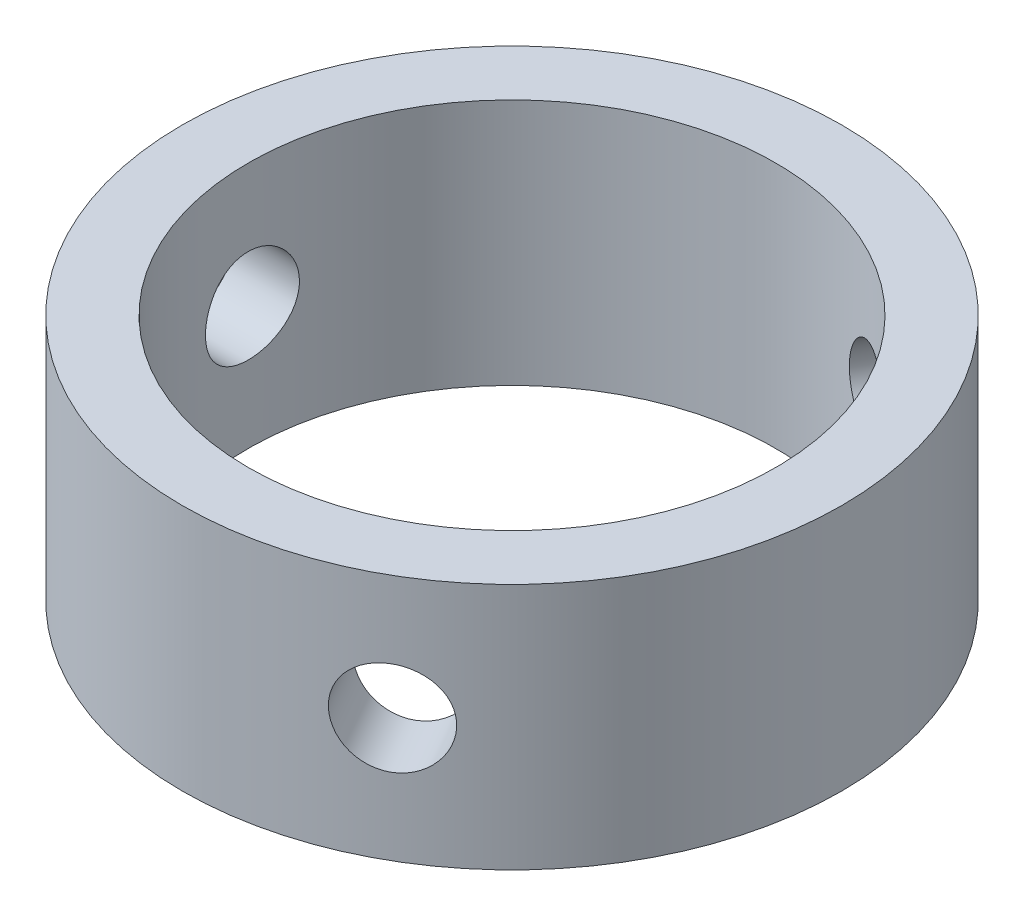
ISO-10303-21;
HEADER;
FILE_DESCRIPTION(('STEP AP214'),'2;1');
FILE_NAME('part.step','',(''),(''),'','','');
FILE_SCHEMA(('AUTOMOTIVE_DESIGN { 1 0 10303 214 1 1 1 1 }'));
ENDSEC;
DATA;
#1=APPLICATION_CONTEXT('core data for automotive mechanical design processes');
#2=APPLICATION_PROTOCOL_DEFINITION('international standard','automotive_design',2000,#1);
#3=PRODUCT_CONTEXT('',#1,'mechanical');
#4=PRODUCT('Part','Part','',(#3));
#5=PRODUCT_RELATED_PRODUCT_CATEGORY('part','',(#4));
#6=PRODUCT_DEFINITION_FORMATION('','',#4);
#7=PRODUCT_DEFINITION_CONTEXT('part definition',#1,'design');
#8=PRODUCT_DEFINITION('design','',#6,#7);
#9=PRODUCT_DEFINITION_SHAPE('','',#8);
#10=(LENGTH_UNIT() NAMED_UNIT(*) SI_UNIT(.MILLI.,.METRE.));
#11=(NAMED_UNIT(*) PLANE_ANGLE_UNIT() SI_UNIT($,.RADIAN.));
#12=(NAMED_UNIT(*) SI_UNIT($,.STERADIAN.) SOLID_ANGLE_UNIT());
#13=UNCERTAINTY_MEASURE_WITH_UNIT(LENGTH_MEASURE(1.E-05),#10,'distance_accuracy_value','');
#14=(GEOMETRIC_REPRESENTATION_CONTEXT(3) GLOBAL_UNCERTAINTY_ASSIGNED_CONTEXT((#13)) GLOBAL_UNIT_ASSIGNED_CONTEXT((#10,
#11,#12)) REPRESENTATION_CONTEXT('',''));
#15=CARTESIAN_POINT('',(0.,0.,0.));
#16=DIRECTION('',(0.,0.,1.));
#17=DIRECTION('',(1.,0.,0.));
#18=AXIS2_PLACEMENT_3D('',#15,#16,#17);
#19=CARTESIAN_POINT('',(0.,15.,0.));
#20=DIRECTION('',(0.,1.,0.));
#21=DIRECTION('',(0.,0.,1.));
#22=AXIS2_PLACEMENT_3D('',#19,#20,#21);
#23=PLANE('',#22);
#24=CARTESIAN_POINT('',(0.,15.,0.));
#25=DIRECTION('',(0.,1.,0.));
#26=DIRECTION('',(0.,0.,1.));
#27=AXIS2_PLACEMENT_3D('',#24,#25,#26);
#28=CIRCLE('',#27,20.);
#29=CARTESIAN_POINT('',(0.,15.,20.));
#30=VERTEX_POINT('',#29);
#31=EDGE_CURVE('E11',#30,#30,#28,.T.);
#32=ORIENTED_EDGE('',*,*,#31,.T.);
#33=EDGE_LOOP('',(#32));
#34=FACE_BOUND('',#33,.T.);
#35=CARTESIAN_POINT('',(0.,15.,0.));
#36=DIRECTION('',(0.,1.,0.));
#37=DIRECTION('',(0.,0.,1.));
#38=AXIS2_PLACEMENT_3D('',#35,#36,#37);
#39=CIRCLE('',#38,16.);
#40=CARTESIAN_POINT('',(0.,15.,16.));
#41=VERTEX_POINT('',#40);
#42=EDGE_CURVE('E55',#41,#41,#39,.T.);
#43=ORIENTED_EDGE('',*,*,#42,.F.);
#44=EDGE_LOOP('',(#43));
#45=FACE_BOUND('',#44,.T.);
#46=ADVANCED_FACE('F37',(#34,#45),#23,.T.);
#47=CARTESIAN_POINT('',(0.,0.,0.));
#48=DIRECTION('',(0.,1.,0.));
#49=DIRECTION('',(0.,0.,1.));
#50=AXIS2_PLACEMENT_3D('',#47,#48,#49);
#51=PLANE('',#50);
#52=CARTESIAN_POINT('',(0.,0.,0.));
#53=DIRECTION('',(0.,1.,0.));
#54=DIRECTION('',(0.,0.,1.));
#55=AXIS2_PLACEMENT_3D('',#52,#53,#54);
#56=CIRCLE('',#55,20.);
#57=CARTESIAN_POINT('',(0.,0.,20.));
#58=VERTEX_POINT('',#57);
#59=EDGE_CURVE('E50',#58,#58,#56,.T.);
#60=ORIENTED_EDGE('',*,*,#59,.F.);
#61=EDGE_LOOP('',(#60));
#62=FACE_BOUND('',#61,.T.);
#63=CARTESIAN_POINT('',(0.,0.,0.));
#64=DIRECTION('',(0.,1.,0.));
#65=DIRECTION('',(0.,0.,1.));
#66=AXIS2_PLACEMENT_3D('',#63,#64,#65);
#67=CIRCLE('',#66,16.);
#68=CARTESIAN_POINT('',(0.,0.,16.));
#69=VERTEX_POINT('',#68);
#70=EDGE_CURVE('E58',#69,#69,#67,.T.);
#71=ORIENTED_EDGE('',*,*,#70,.T.);
#72=EDGE_LOOP('',(#71));
#73=FACE_BOUND('',#72,.T.);
#74=ADVANCED_FACE('F96',(#62,#73),#51,.F.);
#75=CARTESIAN_POINT('',(0.,15.,0.));
#76=DIRECTION('',(0.,-1.,0.));
#77=DIRECTION('',(0.,0.,-1.));
#78=AXIS2_PLACEMENT_3D('',#75,#76,#77);
#79=CYLINDRICAL_SURFACE('',#78,20.);
#80=CARTESIAN_POINT('',(7.42977561887967,7.5,18.5687488607364));
#81=CARTESIAN_POINT('',(7.42978264853861,7.65921134504986,18.5687477524478));
#82=CARTESIAN_POINT('',(7.44233921284367,7.81851737559687,18.5637371049418));
#83=CARTESIAN_POINT('',(7.49214324130476,8.1326819630868,18.5436911779605));
#84=CARTESIAN_POINT('',(7.52941533606475,8.28753592247398,18.5286458982467));
#85=CARTESIAN_POINT('',(7.62727932957909,8.58820307919669,18.4885745111522));
#86=CARTESIAN_POINT('',(7.68785399220678,8.73402286646515,18.4635557803036));
#87=CARTESIAN_POINT('',(7.83020206551314,9.01266823068499,18.4036374434973));
#88=CARTESIAN_POINT('',(7.91197233394056,9.14549572972784,18.3687393020929));
#89=CARTESIAN_POINT('',(8.09457547895947,9.3953699302968,18.2890078621628));
#90=CARTESIAN_POINT('',(8.19552825737957,9.51230897976544,18.2441117494471));
#91=CARTESIAN_POINT('',(8.41286450396254,9.72615484458065,18.1449153040432));
#92=CARTESIAN_POINT('',(8.52924879361443,9.8230605927608,18.0906144706521));
#93=CARTESIAN_POINT('',(8.77429663806955,9.99448304591085,17.973041966131));
#94=CARTESIAN_POINT('',(8.90301111976894,10.0689011135908,17.9097325147886));
#95=CARTESIAN_POINT('',(9.16825999284671,10.1926031596815,17.7754066944427));
#96=CARTESIAN_POINT('',(9.3047940100672,10.2418883395631,17.7043906940457));
#97=CARTESIAN_POINT('',(9.58054316126853,10.3136006119191,17.5566932543471));
#98=CARTESIAN_POINT('',(9.71973382395208,10.3362076353181,17.4800535161826));
#99=CARTESIAN_POINT('',(9.99755043870953,10.3544802235679,17.3226576038764));
#100=CARTESIAN_POINT('',(10.136176418904,10.3501471468344,17.2419016374932));
#101=CARTESIAN_POINT('',(10.4079022617264,10.3148052295482,17.0792410055284));
#102=CARTESIAN_POINT('',(10.5410348926976,10.2839899439474,16.9973489064977));
#103=CARTESIAN_POINT('',(10.7992624488474,10.1968617618824,16.8344661405579));
#104=CARTESIAN_POINT('',(10.9243571837381,10.1405482620311,16.7534754950272));
#105=CARTESIAN_POINT('',(11.1637643199213,10.0038216000716,16.5949111052232));
#106=CARTESIAN_POINT('',(11.2780381642381,9.92332623119646,16.5173500685271));
#107=CARTESIAN_POINT('',(11.492601714433,9.74058074382692,16.3687862130137));
#108=CARTESIAN_POINT('',(11.5928905878388,9.63832933119196,16.2977837846903));
#109=CARTESIAN_POINT('',(11.7780373020307,9.41389416320864,16.1644978830877));
#110=CARTESIAN_POINT('',(11.862750241873,9.29154150830687,16.1022974127794));
#111=CARTESIAN_POINT('',(12.0137474143602,9.03095285035189,15.9899580344834));
#112=CARTESIAN_POINT('',(12.0800315534681,8.89271676668594,15.9398191877157));
#113=CARTESIAN_POINT('',(12.1927416668254,8.60411928588138,15.8537726230847));
#114=CARTESIAN_POINT('',(12.2391546117137,8.45375000966679,15.8178742436957));
#115=CARTESIAN_POINT('',(12.3110135839769,8.14524353761208,15.762012418697));
#116=CARTESIAN_POINT('',(12.3364609383842,7.98710683408841,15.7420479645403));
#117=CARTESIAN_POINT('',(12.3656836026233,7.66903668118748,15.7191035561024));
#118=CARTESIAN_POINT('',(12.3696466666082,7.50913107617737,15.7159764594908));
#119=CARTESIAN_POINT('',(12.3563163330762,7.19076503509545,15.7264590981484));
#120=CARTESIAN_POINT('',(12.3390235287734,7.03230455881695,15.7400683663348));
#121=CARTESIAN_POINT('',(12.2836977212945,6.72205090477182,15.7832816842431));
#122=CARTESIAN_POINT('',(12.2457578802606,6.57023106324695,15.81281388212));
#123=CARTESIAN_POINT('',(12.1500348622569,6.27672956226434,15.8864810074236));
#124=CARTESIAN_POINT('',(12.0922507939255,6.13504835855867,15.9306165908009));
#125=CARTESIAN_POINT('',(11.9576310597972,5.86478411697614,16.0319112001457));
#126=CARTESIAN_POINT('',(11.8806682019176,5.73629695561669,16.0891569576804));
#127=CARTESIAN_POINT('',(11.709576239481,5.49705133076851,16.2140993364913));
#128=CARTESIAN_POINT('',(11.6154462616126,5.38629376974364,16.2817964894152));
#129=CARTESIAN_POINT('',(11.4113584774151,5.18480908775382,16.4254850228954));
#130=CARTESIAN_POINT('',(11.3012874979564,5.09423806297832,16.5015346806193));
#131=CARTESIAN_POINT('',(11.0684678138677,4.93678258233265,16.6585926909502));
#132=CARTESIAN_POINT('',(10.9457194281072,4.86989753088661,16.7396009188157));
#133=CARTESIAN_POINT('',(10.6910764592703,4.76196470684146,16.9033636373091));
#134=CARTESIAN_POINT('',(10.5592143197017,4.72083004516869,16.9861112708798));
#135=CARTESIAN_POINT('',(10.2895130243059,4.66528396116872,17.1508271996182));
#136=CARTESIAN_POINT('',(10.1516742236317,4.65087095317402,17.2327955407419));
#137=CARTESIAN_POINT('',(9.87515820448499,4.64921311929053,17.392715066811));
#138=CARTESIAN_POINT('',(9.7364992150946,4.66172887546017,17.4706953939576));
#139=CARTESIAN_POINT('',(9.46116967078909,4.71306205748906,17.6213195004454));
#140=CARTESIAN_POINT('',(9.32449911125799,4.75187942228148,17.6939632921764));
#141=CARTESIAN_POINT('',(9.05729984758114,4.8546320231512,17.832216730742));
#142=CARTESIAN_POINT('',(8.92676753394524,4.91855228574463,17.8978305412082));
#143=CARTESIAN_POINT('',(8.67570606408871,5.06967101634516,18.0208682554047));
#144=CARTESIAN_POINT('',(8.55517716840662,5.15687009039855,18.0782919458517));
#145=CARTESIAN_POINT('',(8.32687061354947,5.35294359704358,18.1845880315981));
#146=CARTESIAN_POINT('',(8.21920956790659,5.46199531462706,18.2333839011666));
#147=CARTESIAN_POINT('',(8.02127197896975,5.69830608773447,18.3213252228589));
#148=CARTESIAN_POINT('',(7.93099953059952,5.82556941973023,18.3604684024315));
#149=CARTESIAN_POINT('',(7.77046961602043,6.09544071807938,18.4289848019259));
#150=CARTESIAN_POINT('',(7.70031534584479,6.23812280714982,18.4583077736134));
#151=CARTESIAN_POINT('',(7.58315170488393,6.53419490644415,18.5067518750354));
#152=CARTESIAN_POINT('',(7.53611794617356,6.68757343795642,18.5258837563023));
#153=CARTESIAN_POINT('',(7.47770113676727,6.95139649000744,18.5495178322789));
#154=CARTESIAN_POINT('',(7.45976109647252,7.06019971256594,18.5567274249197));
#155=CARTESIAN_POINT('',(7.43579596715272,7.27932013571408,18.5663432966469));
#156=CARTESIAN_POINT('',(7.42977074603594,7.38963731950578,18.5687496289839));
#157=CARTESIAN_POINT('',(7.42977561887967,7.5,18.5687488607364));
#158=B_SPLINE_CURVE_WITH_KNOTS('',3,(#80,#81,#82,#83,#84,#85,#86,#87,#88,#89,#90,#91,#92,#93,
#94,#95,#96,#97,#98,#99,#100,#101,#102,#103,#104,#105,#106,#107,#108,#109,#110,#111,#112,#113,
#114,#115,#116,#117,#118,#119,#120,#121,#122,#123,#124,#125,#126,#127,#128,#129,#130,#131,#132,
#133,#134,#135,#136,#137,#138,#139,#140,#141,#142,#143,#144,#145,#146,#147,#148,#149,#150,#151,
#152,#153,#154,#155,#156,#157),.UNSPECIFIED.,.T.,.F.,(4,2,2,2,2,2,2,2,2,2,2,2,2,2,2,2,2,2,2,2,2,
2,2,2,2,2,2,2,2,2,2,2,2,2,2,2,2,2,4),(0.,0.4772307186788,0.954937744422304,1.43229210361658,
1.9095757354009,2.38994712005683,2.87034408732557,3.35281860592355,3.83527005779648,
4.31444867149444,4.79360312349976,5.26928499763365,5.74497812884471,6.2223070490207,
6.69966437065991,7.18125965892882,7.66285739153323,8.14477042156272,8.62665294621003,
9.1043173625113,9.58196844833439,10.0574819666097,10.5330168467603,11.0117935173037,
11.4905945505703,11.9729785955743,12.4553505103317,12.9360858664574,13.4167926947518,
13.8932433315584,14.3696928621498,14.845858628684,15.3220367930439,15.8022470181978,
16.2825701924617,16.7653148258191,17.2475491530443,17.5783612897127,17.9091697588647),.UNSPECIFIED.);
#159=CARTESIAN_POINT('',(7.42977561887967,7.5,18.5687488607364));
#160=VERTEX_POINT('',#159);
#161=EDGE_CURVE('E157',#160,#160,#158,.T.);
#162=ORIENTED_EDGE('',*,*,#161,.T.);
#163=EDGE_LOOP('',(#162));
#164=FACE_BOUND('',#163,.T.);
#165=CARTESIAN_POINT('',(12.3661204204512,7.5,-15.7187488607363));
#166=CARTESIAN_POINT('',(12.3661159458156,7.65921134504986,-15.7187543944552));
#167=CARTESIAN_POINT('',(12.3554983156335,7.81851737559687,-15.7271233743747));
#168=CARTESIAN_POINT('',(12.3132360193948,8.1326819630868,-15.7602319647421));
#169=CARTESIAN_POINT('',(12.2815703775755,8.28753592247398,-15.7849879057996));
#170=CARTESIAN_POINT('',(12.1979355416297,8.58820307919669,-15.8497049167516));
#171=CARTESIAN_POINT('',(12.1459813538305,8.73402286646515,-15.8896547479885));
#172=CARTESIAN_POINT('',(12.0229165153505,9.01266823068498,-15.9829726272485));
#173=CARTESIAN_POINT('',(11.9518087041358,9.14549572972783,-16.0363386862787));
#174=CARTESIAN_POINT('',(11.7914576791665,9.3953699302968,-16.1546119287109));
#175=CARTESIAN_POINT('',(11.7021001158135,9.51230897976544,-16.2195915430475));
#176=CARTESIAN_POINT('',(11.5075253508371,9.72615484458065,-16.3582120310496));
#177=CARTESIAN_POINT('',(11.4023073048478,9.8230605927608,-16.431853365794));
#178=CARTESIAN_POINT('',(11.1779626069185,9.99448304591085,-16.5852847719742));
#179=CARTESIAN_POINT('',(11.0587777729065,10.0689011135908,-16.6651000572896));
#180=CARTESIAN_POINT('',(10.8098237635639,10.1926031596815,-16.8276494095272));
#181=CARTESIAN_POINT('',(10.6800550945347,10.2418883395631,-16.9103833367224));
#182=CARTESIAN_POINT('',(10.4142707840811,10.3136006119191,-17.0753403868854));
#183=CARTESIAN_POINT('',(10.2783034925495,10.3362076353181,-17.1575631676567));
#184=CARTESIAN_POINT('',(10.0030863266618,10.3544802235679,-17.3194614574769));
#185=CARTESIAN_POINT('',(9.86383661816951,10.3501471468344,-17.3991370947583));
#186=CARTESIAN_POINT('',(9.58710545728116,10.3148052295482,-17.5531282615248));
#187=CARTESIAN_POINT('',(9.4496185036658,10.2839899439474,-17.6274784525032));
#188=CARTESIAN_POINT('',(9.17944411244835,10.1968617618824,-17.7696686931162));
#189=CARTESIAN_POINT('',(9.04675678850447,10.1405482620311,-17.8375085886458));
#190=CARTESIAN_POINT('',(8.78973243070706,10.0038216000716,-17.9655590555258));
#191=CARTESIAN_POINT('',(8.66542568042601,9.92332623119646,-18.0257425893442));
#192=CARTESIAN_POINT('',(8.42948383236978,9.74058074382692,-18.1372781467825));
#193=CARTESIAN_POINT('',(8.31784948900844,9.63832933119196,-18.1886296447071));
#194=CARTESIAN_POINT('',(8.10984715515825,9.41389416320864,-18.2823284518232));
#195=CARTESIAN_POINT('',(8.01362349782281,9.29154150830687,-18.3245917746018));
#196=CARTESIAN_POINT('',(7.84083615612951,9.03095285035189,-18.3991894727273));
#197=CARTESIAN_POINT('',(7.76427257155827,8.89271676668594,-18.4315237976789));
#198=CARTESIAN_POINT('',(7.63339900400078,8.60411928588137,-18.4861103367942));
#199=CARTESIAN_POINT('',(7.5791036230511,8.45375000966679,-18.5083559364375));
#200=CARTESIAN_POINT('',(7.49479637736885,8.14524353761207,-18.5426567194079));
#201=CARTESIAN_POINT('',(7.4647829756928,7.98710683408841,-18.5547125477053));
#202=CARTESIAN_POINT('',(7.43030120299125,7.66903668118748,-18.5685479130838));
#203=CARTESIAN_POINT('',(7.42561152589307,7.50913107617737,-18.5704164788657));
#204=CARTESIAN_POINT('',(7.44135492403524,7.19076503509545,-18.5641133907148));
#205=CARTESIAN_POINT('',(7.46178729816297,7.03230455881695,-18.5559420169792));
#206=CARTESIAN_POINT('',(7.52687403299284,6.72205090477183,-18.5296351211716));
#207=CARTESIAN_POINT('',(7.57141958710074,6.57023106324696,-18.5115443539592));
#208=CARTESIAN_POINT('',(7.68307869803933,6.27672956226434,-18.4654793512929));
#209=CARTESIAN_POINT('',(7.75019326862061,6.13504835855867,-18.4375046718725));
#210=CARTESIAN_POINT('',(7.90522684064375,5.86478411697614,-18.3715678669391));
#211=CARTESIAN_POINT('',(7.99328454986749,5.73629695561669,-18.3335389556349));
#212=CARTESIAN_POINT('',(8.1870338051453,5.49705133076851,-18.2478401591869));
#213=CARTESIAN_POINT('',(8.29272624827549,5.38629376974364,-18.2001697835571));
#214=CARTESIAN_POINT('',(8.51920806060062,5.18480908775382,-18.0952688445802));
#215=CARTESIAN_POINT('',(8.64010448586795,5.09423806297832,-18.0379694090114));
#216=CARTESIAN_POINT('',(8.89253055472673,4.93678258233265,-17.914870653255));
#217=CARTESIAN_POINT('',(9.02405993085402,4.86989753088661,-17.8490715468455));
#218=CARTESIAN_POINT('',(9.29320408968058,4.76196470684146,-17.7104256261845));
#219=CARTESIAN_POINT('',(9.43079671224018,4.72083004516869,-17.637603480306));
#220=CARTESIAN_POINT('',(9.7082955386334,4.66528396116872,-17.4863932714289));
#221=CARTESIAN_POINT('',(9.84820160468978,4.65087095317402,-17.4080055389797));
#222=CARTESIAN_POINT('',(10.1249539864001,4.64921311929053,-17.2484954048799));
#223=CARTESIAN_POINT('',(10.2618164253997,4.66172887546017,-17.167403361178));
#224=CARTESIAN_POINT('',(10.5299255001932,4.71306205748906,-17.0042730346409));
#225=CARTESIAN_POINT('',(10.661172149025,4.75187942228148,-16.9222347540031));
#226=CARTESIAN_POINT('',(10.9145027708218,4.8546320231512,-16.7599601230692));
#227=CARTESIAN_POINT('',(11.0365921543426,4.91855228574463,-16.6797227286789));
#228=CARTESIAN_POINT('',(11.2686766753886,5.06967101634516,-16.5238159749699));
#229=CARTESIAN_POINT('',(11.3786714979358,5.15687009039855,-16.4481467346426));
#230=CARTESIAN_POINT('',(11.5848798859436,5.35294359704358,-16.3035755011591));
#231=CARTESIAN_POINT('',(11.6809688714111,5.46199531462706,-16.2347362354186));
#232=CARTESIAN_POINT('',(11.8560970845075,5.69830608773448,-16.1072879158816));
#233=CARTESIAN_POINT('',(11.9351322965873,5.82556941973023,-16.0486812721174));
#234=CARTESIAN_POINT('',(12.0747341964149,6.09544071807937,-15.9439164877718));
#235=CARTESIAN_POINT('',(12.1352057698985,6.23812280714982,-15.8978225934595));
#236=CARTESIAN_POINT('',(12.2357414128739,6.53419490644415,-15.8205779546985));
#237=CARTESIAN_POINT('',(12.2758269874284,6.68757343795642,-15.7894114654533));
#238=CARTESIAN_POINT('',(12.3255031023223,6.95139649000744,-15.7506380624878));
#239=CARTESIAN_POINT('',(12.3407168128476,7.06019971256594,-15.738706328168));
#240=CARTESIAN_POINT('',(12.3610269667027,7.27932013571408,-15.7227598532357));
#241=CARTESIAN_POINT('',(12.3661235221948,7.38963731950578,-15.7187450248536));
#242=CARTESIAN_POINT('',(12.3661204204512,7.5,-15.7187488607363));
#243=B_SPLINE_CURVE_WITH_KNOTS('',3,(#165,#166,#167,#168,#169,#170,#171,#172,#173,#174,#175,
#176,#177,#178,#179,#180,#181,#182,#183,#184,#185,#186,#187,#188,#189,#190,#191,#192,#193,#194,
#195,#196,#197,#198,#199,#200,#201,#202,#203,#204,#205,#206,#207,#208,#209,#210,#211,#212,#213,
#214,#215,#216,#217,#218,#219,#220,#221,#222,#223,#224,#225,#226,#227,#228,#229,#230,#231,#232,
#233,#234,#235,#236,#237,#238,#239,#240,#241,#242),.UNSPECIFIED.,.T.,.F.,(4,2,2,2,2,2,2,2,2,2,2,
2,2,2,2,2,2,2,2,2,2,2,2,2,2,2,2,2,2,2,2,2,2,2,2,2,2,2,4),(0.,0.4772307186788,0.954937744422304,
1.43229210361658,1.90957573540089,2.38994712005683,2.87034408732557,3.35281860592355,
3.83527005779648,4.31444867149445,4.79360312349976,5.26928499763365,5.74497812884472,
6.2223070490207,6.69966437065991,7.18125965892882,7.66285739153323,8.14477042156273,
8.62665294621003,9.1043173625113,9.58196844833439,10.0574819666097,10.5330168467603,
11.0117935173037,11.4905945505703,11.9729785955743,12.4553505103317,12.9360858664574,
13.4167926947518,13.8932433315584,14.3696928621498,14.845858628684,15.3220367930439,
15.8022470181978,16.2825701924617,16.7653148258191,17.2475491530443,17.5783612897127,
17.9091697588647),.UNSPECIFIED.);
#244=CARTESIAN_POINT('',(12.3661204204512,7.5,-15.7187488607363));
#245=VERTEX_POINT('',#244);
#246=EDGE_CURVE('E67',#245,#245,#243,.T.);
#247=ORIENTED_EDGE('',*,*,#246,.T.);
#248=EDGE_LOOP('',(#247));
#249=FACE_BOUND('',#248,.T.);
#250=CARTESIAN_POINT('',(-20.,4.65,0.));
#251=CARTESIAN_POINT('',(-19.999997539858,4.65000663401519,-0.159220597601902));
#252=CARTESIAN_POINT('',(-19.9980786844987,4.66338776409981,-0.318535855093512));
#253=CARTESIAN_POINT('',(-19.9906086304443,4.71654879190933,-0.632719610397276));
#254=CARTESIAN_POINT('',(-19.9850538133884,4.75635498734231,-0.787583517976093));
#255=CARTESIAN_POINT('',(-19.9709365650736,4.86115793459101,-1.08827172153135));
#256=CARTESIAN_POINT('',(-19.9623763286804,4.92613630667082,-1.23410252322149));
#257=CARTESIAN_POINT('',(-19.9431961042645,5.07939563281154,-1.51276638360188));
#258=CARTESIAN_POINT('',(-19.9325764236574,5.16767310969667,-1.64560137774481));
#259=CARTESIAN_POINT('',(-19.9103756970087,5.36569127382669,-1.89546728302553));
#260=CARTESIAN_POINT('',(-19.8987889931623,5.47556423386648,-2.01239287658));
#261=CARTESIAN_POINT('',(-19.8760048164301,5.71336996106828,-2.22621272310081));
#262=CARTESIAN_POINT('',(-19.8648073651122,5.84130372696541,-2.32310586757241));
#263=CARTESIAN_POINT('',(-19.8440144444241,6.11230010913558,-2.4945150070151));
#264=CARTESIAN_POINT('',(-19.8344262830255,6.25542716512327,-2.5689300865771));
#265=CARTESIAN_POINT('',(-19.8180140944292,6.55230737296626,-2.6926259707918));
#266=CARTESIAN_POINT('',(-19.8111899313486,6.7060600020152,-2.74190801105827));
#267=CARTESIAN_POINT('',(-19.8011336049838,7.01872344376345,-2.81361392025149));
#268=CARTESIAN_POINT('',(-19.7978774341475,7.17759228348999,-2.83621737885531));
#269=CARTESIAN_POINT('',(-19.7952527280753,7.4968989120245,-2.85448064673573));
#270=CARTESIAN_POINT('',(-19.7958839910511,7.65733661896434,-2.8501418545263));
#271=CARTESIAN_POINT('',(-19.8009408655297,7.97396357498162,-2.81479075318449));
#272=CARTESIAN_POINT('',(-19.805338123578,8.13017559502493,-2.78397775770168));
#273=CARTESIAN_POINT('',(-19.8173872639575,8.43518924940246,-2.69686459579977));
#274=CARTESIAN_POINT('',(-19.8250392301047,8.58399069278768,-2.64056377301033));
#275=CARTESIAN_POINT('',(-19.8427671946178,8.87056975424894,-2.50386363333996));
#276=CARTESIAN_POINT('',(-19.852851729747,9.00830622030809,-2.42337919748618));
#277=CARTESIAN_POINT('',(-19.8743022655916,9.26839403365232,-2.240657192388));
#278=CARTESIAN_POINT('',(-19.8856683422978,9.39074446769032,-2.13841833286552));
#279=CARTESIAN_POINT('',(-19.9085268252002,9.61774284816231,-1.91399224067261));
#280=CARTESIAN_POINT('',(-19.920019446624,9.72222128627937,-1.79163350336117));
#281=CARTESIAN_POINT('',(-19.941740732093,9.9091850374753,-1.53102739782766));
#282=CARTESIAN_POINT('',(-19.9519693915344,9.99167027045049,-1.39277997173842));
#283=CARTESIAN_POINT('',(-19.970019481073,10.1323121230617,-1.10417906584821));
#284=CARTESIAN_POINT('',(-19.9778396943888,10.1904564506367,-0.953819515062551));
#285=CARTESIAN_POINT('',(-19.9901813636095,10.2806227195811,-0.645334234160165));
#286=CARTESIAN_POINT('',(-19.994703020594,10.3126462532857,-0.487208978067434));
#287=CARTESIAN_POINT('',(-19.999911639521,10.3494383238917,-0.169144702322915));
#288=CARTESIAN_POINT('',(-20.000631408829,10.3544400468228,-0.00923317347973368));
#289=CARTESIAN_POINT('',(-19.998244227893,10.3376643269521,0.309146157725145));
#290=CARTESIAN_POINT('',(-19.9951373842532,10.3158876301608,0.4676140001821));
#291=CARTESIAN_POINT('',(-19.9854663808907,10.246367089802,0.77790712938567));
#292=CARTESIAN_POINT('',(-19.978917248428,10.1987360834974,0.929758205533331));
#293=CARTESIAN_POINT('',(-19.9630939695891,10.0789774492471,1.22331863158352));
#294=CARTESIAN_POINT('',(-19.9538197062036,10.0068487694196,1.36502754568522));
#295=CARTESIAN_POINT('',(-19.9334961515912,9.8395897490991,1.63531156595823));
#296=CARTESIAN_POINT('',(-19.9224355354243,9.74431055620133,1.76379369136366));
#297=CARTESIAN_POINT('',(-19.8998077647578,9.53366343212809,2.00302705768156));
#298=CARTESIAN_POINT('',(-19.8882405838533,9.41829445282773,2.11377737291061));
#299=CARTESIAN_POINT('',(-19.8658002275954,9.16970794741774,2.31524511039574));
#300=CARTESIAN_POINT('',(-19.8549328798402,9.03636356909707,2.40580675907755));
#301=CARTESIAN_POINT('',(-19.8352235399862,8.75621885656584,2.56324580614879));
#302=CARTESIAN_POINT('',(-19.826381497464,8.60941885748353,2.63012379420634));
#303=CARTESIAN_POINT('',(-19.8117653593948,8.30700662668857,2.73805221349558));
#304=CARTESIAN_POINT('',(-19.8059813153745,8.15142481586857,2.77918647710155));
#305=CARTESIAN_POINT('',(-19.7981089752667,7.83547319963288,2.83472769283635));
#306=CARTESIAN_POINT('',(-19.7960204508702,7.67510369062332,2.84913629607712));
#307=CARTESIAN_POINT('',(-19.7957835702566,7.35568060201485,2.85078075598099));
#308=CARTESIAN_POINT('',(-19.7975997098805,7.19662825470876,2.8382614610153));
#309=CARTESIAN_POINT('',(-19.8048906293529,6.88291478116467,2.78692822264851));
#310=CARTESIAN_POINT('',(-19.8103654055295,6.72825365051968,2.74811430563739));
#311=CARTESIAN_POINT('',(-19.824344771114,6.42776946050174,2.64537707190892));
#312=CARTESIAN_POINT('',(-19.8328474973397,6.28194103054456,2.58146919373022));
#313=CARTESIAN_POINT('',(-19.8519272207514,6.00303698214488,2.43038232128556));
#314=CARTESIAN_POINT('',(-19.8625042742622,5.86996171013792,2.34320269509322));
#315=CARTESIAN_POINT('',(-19.8846556504724,5.61909486602407,2.14715120782728));
#316=CARTESIAN_POINT('',(-19.896237834646,5.50144602758159,2.03809757493737));
#317=CARTESIAN_POINT('',(-19.9190275961439,5.28602962970488,1.80177724882134));
#318=CARTESIAN_POINT('',(-19.9302350854192,5.18826671616852,1.674506311338));
#319=CARTESIAN_POINT('',(-19.9510754611919,5.01497069651331,1.40462820691276));
#320=CARTESIAN_POINT('',(-19.9607002861389,4.9395499222891,1.26194830543444));
#321=CARTESIAN_POINT('',(-19.9772112527449,4.8138532780493,0.965880706730124));
#322=CARTESIAN_POINT('',(-19.9841002739964,4.76355095496615,0.812504469061582));
#323=CARTESIAN_POINT('',(-19.9927625847196,4.70113287737581,0.548670962429879));
#324=CARTESIAN_POINT('',(-19.9954629075567,4.68198678715794,0.43985425347647));
#325=CARTESIAN_POINT('',(-19.9990824584098,4.65641811694065,0.220706848975509));
#326=CARTESIAN_POINT('',(-20.0000017054392,4.6499954011152,0.110376169602727));
#327=CARTESIAN_POINT('',(-20.,4.65,0.));
#328=B_SPLINE_CURVE_WITH_KNOTS('',3,(#250,#251,#252,#253,#254,#255,#256,#257,#258,#259,#260,
#261,#262,#263,#264,#265,#266,#267,#268,#269,#270,#271,#272,#273,#274,#275,#276,#277,#278,#279,
#280,#281,#282,#283,#284,#285,#286,#287,#288,#289,#290,#291,#292,#293,#294,#295,#296,#297,#298,
#299,#300,#301,#302,#303,#304,#305,#306,#307,#308,#309,#310,#311,#312,#313,#314,#315,#316,#317,
#318,#319,#320,#321,#322,#323,#324,#325,#326,#327),.UNSPECIFIED.,.T.,.F.,(4,2,2,2,2,2,2,2,2,2,2,
2,2,2,2,2,2,2,2,2,2,2,2,2,2,2,2,2,2,2,2,2,2,2,2,2,2,2,4),(0.,0.477258517787081,
0.954992707363483,1.43237872964785,1.90969354673257,2.39002854327752,2.87039011202972,
3.35287726613205,3.83534069746631,4.31453750881385,4.79370944629931,5.26930518853187,
5.74491317914883,6.22221517450057,6.69954548703763,7.1811783795388,7.6628130262198,
8.14469060394401,8.62653880399993,9.10422215011185,9.5818921889122,10.0574940766366,
10.5331163883509,11.0118817628239,11.4906721229448,11.9730378967639,12.4553916599515,
12.9361663902525,13.4169114172896,13.8933036454507,14.3696953954926,14.84579451347,
15.3219065608671,15.8021524769137,16.2825104630464,16.765244127928,17.2474683322274,
17.5783208114913,17.9091697587822),.UNSPECIFIED.);
#329=CARTESIAN_POINT('',(-20.,4.65,0.));
#330=VERTEX_POINT('',#329);
#331=EDGE_CURVE('E66',#330,#330,#328,.T.);
#332=ORIENTED_EDGE('',*,*,#331,.T.);
#333=EDGE_LOOP('',(#332));
#334=FACE_BOUND('',#333,.T.);
#335=ORIENTED_EDGE('',*,*,#31,.F.);
#336=EDGE_LOOP('',(#335));
#337=FACE_BOUND('',#336,.T.);
#338=ORIENTED_EDGE('',*,*,#59,.T.);
#339=EDGE_LOOP('',(#338));
#340=FACE_BOUND('',#339,.T.);
#341=ADVANCED_FACE('F39',(#164,#249,#334,#337,#340),#79,.T.);
#342=CARTESIAN_POINT('',(0.,15.,0.));
#343=DIRECTION('',(0.,-1.,0.));
#344=DIRECTION('',(0.,0.,-1.));
#345=AXIS2_PLACEMENT_3D('',#342,#343,#344);
#346=CYLINDRICAL_SURFACE('',#345,16.);
#347=CARTESIAN_POINT('',(5.40389054357638,7.5,15.0598129800156));
#348=CARTESIAN_POINT('',(5.40389743262808,7.65871728104546,15.0598124528528));
#349=CARTESIAN_POINT('',(5.41662472438013,7.81751712608636,15.0552623088547));
#350=CARTESIAN_POINT('',(5.46706752886873,8.13064932764069,15.0370164830197));
#351=CARTESIAN_POINT('',(5.5048050952317,8.28497761574682,15.0233127296045));
#352=CARTESIAN_POINT('',(5.60378243353596,8.58459020669716,14.9866736607381));
#353=CARTESIAN_POINT('',(5.6650013590199,8.7298823990876,14.9637465328046));
#354=CARTESIAN_POINT('',(5.80869898967558,9.00757419247845,14.9085516766875));
#355=CARTESIAN_POINT('',(5.89117569715343,9.13997500333273,14.8762848261667));
#356=CARTESIAN_POINT('',(6.07547987333132,9.38962677818241,14.8019758185222));
#357=CARTESIAN_POINT('',(6.17749382986963,9.50671176799108,14.7598385016414));
#358=CARTESIAN_POINT('',(6.39692565852259,9.72096426497193,14.6660680186407));
#359=CARTESIAN_POINT('',(6.51434449461403,9.81813052473245,14.6144342581893));
#360=CARTESIAN_POINT('',(6.76165932236311,9.99041743890599,14.5016733648638));
#361=CARTESIAN_POINT('',(6.89163527319379,10.0653825211165,14.4404836249774));
#362=CARTESIAN_POINT('',(7.15922198727467,10.1901378907064,14.3097061179736));
#363=CARTESIAN_POINT('',(7.29683218314555,10.239930046171,14.2401189745031));
#364=CARTESIAN_POINT('',(7.57389535874886,10.3124154533551,14.0946911595376));
#365=CARTESIAN_POINT('',(7.71331375425202,10.3353881032658,14.0189239255148));
#366=CARTESIAN_POINT('',(7.99118328550884,10.354452140041,13.8624098433307));
#367=CARTESIAN_POINT('',(8.12963449509751,10.3505456018164,13.7816633800126));
#368=CARTESIAN_POINT('',(8.40003030004878,10.3161781100074,13.6185224709576));
#369=CARTESIAN_POINT('',(8.53203076725335,10.286017924792,13.5361569846184));
#370=CARTESIAN_POINT('',(8.78769526729061,10.2004739966961,13.3715945024964));
#371=CARTESIAN_POINT('',(8.91135901862244,10.1450894025674,13.2893975124939));
#372=CARTESIAN_POINT('',(9.14795210290151,10.0103765487044,13.1276667185301));
#373=CARTESIAN_POINT('',(9.26082282073282,9.93092634489489,13.0481488255356));
#374=CARTESIAN_POINT('',(9.47258421498072,9.75042717760707,12.895240714893));
#375=CARTESIAN_POINT('',(9.57147360233852,9.64937622472508,12.8218510625151));
#376=CARTESIAN_POINT('',(9.75447399571597,9.42688155649242,12.6832024102452));
#377=CARTESIAN_POINT('',(9.83836138043499,9.30517481384254,12.6180700811469));
#378=CARTESIAN_POINT('',(9.98793125737003,9.04570419756339,12.5000134495959));
#379=CARTESIAN_POINT('',(10.0536135319447,8.90794013199743,12.4470892930927));
#380=CARTESIAN_POINT('',(10.1655129799322,8.61994462221596,12.3558726909382));
#381=CARTESIAN_POINT('',(10.2117024838201,8.46969581563117,12.3176010512846));
#382=CARTESIAN_POINT('',(10.2835041170835,8.16117683089623,12.2577220684259));
#383=CARTESIAN_POINT('',(10.3091183345421,8.00290746844576,12.2361130342251));
#384=CARTESIAN_POINT('',(10.3390144676031,7.6851491545006,12.2108624784707));
#385=CARTESIAN_POINT('',(10.3435822010989,7.52570617976881,12.2069802281804));
#386=CARTESIAN_POINT('',(10.3320656245366,7.20811285151516,12.2167292988639));
#387=CARTESIAN_POINT('',(10.3159822312602,7.04996244092515,12.2303598423786));
#388=CARTESIAN_POINT('',(10.2637036076906,6.74063399825127,12.2742628050137));
#389=CARTESIAN_POINT('',(10.227657035464,6.58941327035806,12.3044121971413));
#390=CARTESIAN_POINT('',(10.1362946429706,6.29687506988127,12.3797825854947));
#391=CARTESIAN_POINT('',(10.0809775248118,6.15555826510784,12.4250045968687));
#392=CARTESIAN_POINT('',(9.95149287228142,5.88521093678597,12.5289556098725));
#393=CARTESIAN_POINT('',(9.87713399090597,5.75632458242935,12.5878211058204));
#394=CARTESIAN_POINT('',(9.71133821448678,5.51599357511349,12.7161658659182));
#395=CARTESIAN_POINT('',(9.61989993986911,5.40455033244466,12.7856459873731));
#396=CARTESIAN_POINT('',(9.42061876781061,5.20090900406614,12.9331924157379));
#397=CARTESIAN_POINT('',(9.31259252203366,5.108957383704,13.0113515861685));
#398=CARTESIAN_POINT('',(9.08336081325471,4.94864281467047,13.1724010267704));
#399=CARTESIAN_POINT('',(8.96215582178923,4.8802790223898,13.2552911276184));
#400=CARTESIAN_POINT('',(8.71012185351129,4.7694564590632,13.4222387900258));
#401=CARTESIAN_POINT('',(8.57934269236216,4.72687298318677,13.5062886869474));
#402=CARTESIAN_POINT('',(8.31109677998308,4.66842010387342,13.6729875071751));
#403=CARTESIAN_POINT('',(8.17363066218672,4.65254817518932,13.7556365621823));
#404=CARTESIAN_POINT('',(7.89784244359073,4.64804979663305,13.9157883550968));
#405=CARTESIAN_POINT('',(7.75955842809044,4.6590498420311,13.9933464301527));
#406=CARTESIAN_POINT('',(7.48431744067318,4.70716984082491,14.1424714626802));
#407=CARTESIAN_POINT('',(7.34736045861676,4.74428959448817,14.2140384659598));
#408=CARTESIAN_POINT('',(7.07908250668155,4.84344432014584,14.3495352487703));
#409=CARTESIAN_POINT('',(6.9477536804975,4.90544322055987,14.4134759121564));
#410=CARTESIAN_POINT('',(6.69450792874638,5.05255310529215,14.5328312477587));
#411=CARTESIAN_POINT('',(6.57259155039519,5.13766543206893,14.5882454244523));
#412=CARTESIAN_POINT('',(6.34043790466739,5.32988977337657,14.6906492541658));
#413=CARTESIAN_POINT('',(6.23037305951261,5.43727338642123,14.737520030085));
#414=CARTESIAN_POINT('',(6.027336399534,5.67042515138791,14.8217181000363));
#415=CARTESIAN_POINT('',(5.93436859934465,5.79619760886411,14.8590431533958));
#416=CARTESIAN_POINT('',(5.76804532384994,6.06379002760466,14.9244003900678));
#417=CARTESIAN_POINT('',(5.69485733519582,6.2057333955882,14.9523536679046));
#418=CARTESIAN_POINT('',(5.57186019610213,6.50077050284946,14.9986242125222));
#419=CARTESIAN_POINT('',(5.52202837767908,6.6538532635172,15.016950824415));
#420=CARTESIAN_POINT('',(5.45801628056224,6.92288100219068,15.0403072799482));
#421=CARTESIAN_POINT('',(5.43776068467906,7.03722474814748,15.0476232950704));
#422=CARTESIAN_POINT('',(5.41069544776096,7.26769761186945,15.0573762825873));
#423=CARTESIAN_POINT('',(5.40388550112644,7.38382668899625,15.059813365873));
#424=CARTESIAN_POINT('',(5.40389054357638,7.5,15.0598129800156));
#425=B_SPLINE_CURVE_WITH_KNOTS('',3,(#347,#348,#349,#350,#351,#352,#353,#354,#355,#356,#357,
#358,#359,#360,#361,#362,#363,#364,#365,#366,#367,#368,#369,#370,#371,#372,#373,#374,#375,#376,
#377,#378,#379,#380,#381,#382,#383,#384,#385,#386,#387,#388,#389,#390,#391,#392,#393,#394,#395,
#396,#397,#398,#399,#400,#401,#402,#403,#404,#405,#406,#407,#408,#409,#410,#411,#412,#413,#414,
#415,#416,#417,#418,#419,#420,#421,#422,#423,#424),.UNSPECIFIED.,.T.,.F.,(4,2,2,2,2,2,2,2,2,2,2,
2,2,2,2,2,2,2,2,2,2,2,2,2,2,2,2,2,2,2,2,2,2,2,2,2,2,2,4),(0.,0.475726854579504,
0.951873755975466,1.427598914867,1.90327938391472,2.38374966527604,2.86425002693168,
3.34804182679625,3.83179771915592,4.31046768893565,4.78910070869988,5.26232149883752,
5.73555825994035,6.21123427855985,6.68695412527209,7.16926191815052,7.65157547675069,
8.13457138376612,8.617518267743,9.09388686533258,9.57023431584795,10.0430813804559,
10.5159602979824,10.9937915155766,11.4716613462973,11.9552541820471,12.4388297204986,
12.9200470127317,13.4012188092521,13.8757407463812,14.35025905497,14.8240918442218,
15.2979521602001,15.7779723383309,16.258105088652,16.7421843406593,17.2257927989009,
17.5740095755504,17.9222184376596),.UNSPECIFIED.);
#426=CARTESIAN_POINT('',(5.40389054357638,7.5,15.0598129800156));
#427=VERTEX_POINT('',#426);
#428=EDGE_CURVE('E42',#427,#427,#425,.T.);
#429=ORIENTED_EDGE('',*,*,#428,.F.);
#430=EDGE_LOOP('',(#429));
#431=FACE_BOUND('',#430,.T.);
#432=CARTESIAN_POINT('',(10.3402353451479,7.5,-12.2098129800155));
#433=CARTESIAN_POINT('',(10.3402314440857,7.65871728104546,-12.2098186825279));
#434=CARTESIAN_POINT('',(10.3299272579164,7.81751712608636,-12.2185657685075));
#435=CARTESIAN_POINT('',(10.288904506986,8.13064932764069,-12.2531276057152));
#436=CARTESIAN_POINT('',(10.2581679252198,8.28497761574682,-12.278957420155));
#437=CARTESIAN_POINT('',(10.1769488916583,8.58459020669716,-12.3463547750922));
#438=CARTESIAN_POINT('',(10.1264839536901,8.7298823990876,-12.3879083557869));
#439=CARTESIAN_POINT('',(10.0068349908066,9.00757419247845,-12.4847567263399));
#440=CARTESIAN_POINT('',(9.93765272481655,9.13997500333273,-12.5400502249758));
#441=CARTESIAN_POINT('',(9.78114714837747,9.38962677818241,-12.6625078197471));
#442=CARTESIAN_POINT('',(9.69364818324221,9.50671176799108,-12.7297858392095));
#443=CARTESIAN_POINT('',(9.50272464851196,9.72096426497193,-12.8729341357214));
#444=CARTESIAN_POINT('',(9.39929908222248,9.81813052473245,-12.9488049504338));
#445=CARTESIAN_POINT('',(9.17798787017459,9.99041743890599,-13.1066054273343));
#446=CARTESIAN_POINT('',(9.06000802556664,10.0653825211165,-13.1885730326915));
#447=CARTESIAN_POINT('',(8.81295802521731,10.1901378907064,-13.3549211712988));
#448=CARTESIAN_POINT('',(8.68388869325968,10.239930046171,-13.4393015250075));
#449=CARTESIAN_POINT('',(8.41941292328099,10.3124154533551,-13.6065313660504));
#450=CARTESIAN_POINT('',(8.28408737609122,10.3353881032658,-13.6893876212996));
#451=CARTESIAN_POINT('',(8.00960743924136,10.354452140041,-13.8517726532136));
#452=CARTESIAN_POINT('',(7.87045334594784,10.3505456018164,-13.9313016862431));
#453=CARTESIAN_POINT('',(7.59397127183401,10.3161781100074,-14.0839008678801));
#454=CARTESIAN_POINT('',(7.45664043466695,10.286017924792,-14.1570338826211));
#455=CARTESIAN_POINT('',(7.18629289462088,10.2004739966961,-14.2961645934382));
#456=CARTESIAN_POINT('',(7.05327633749817,10.1450894025674,-14.3621620486176));
#457=CARTESIAN_POINT('',(6.79491681921177,10.0103765487044,-14.4861922729811));
#458=CARTESIAN_POINT('',(6.66961694490744,9.93092634489489,-14.5441822354691));
#459=CARTESIAN_POINT('',(6.43131393952234,9.75042717760707,-14.6511189271073));
#460=CARTESIAN_POINT('',(6.31831194250925,9.64937622472509,-14.7000648225349));
#461=CARTESIAN_POINT('',(6.10673849075428,9.42688155649242,-14.7892234859673));
#462=CARTESIAN_POINT('',(6.008388546788,9.30517481384254,-14.8293059276419));
#463=CARTESIAN_POINT('',(5.8313635663121,9.04570419756339,-14.8998089249331));
#464=CARTESIAN_POINT('',(5.75268876501913,8.90794013199744,-14.9302293650415));
#465=CARTESIAN_POINT('',(5.61774314631267,8.61994462221596,-14.9815288285908));
#466=CARTESIAN_POINT('',(5.56150418218428,8.46969581563117,-15.0023942925192));
#467=CARTESIAN_POINT('',(5.4737466452442,8.16117683089623,-15.0346368395291));
#468=CARTESIAN_POINT('',(5.44222556394569,8.00290746844575,-15.0460148854459));
#469=CARTESIAN_POINT('',(5.40540987467223,7.6851491545006,-15.0592804182746));
#470=CARTESIAN_POINT('',(5.39976388054904,7.52570617976881,-15.0612950663745));
#471=CARTESIAN_POINT('',(5.41396511170543,7.20811285151516,-15.0561959538487));
#472=CARTESIAN_POINT('',(5.43381120529475,7.04996244092515,-15.0490825984496));
#473=CARTESIAN_POINT('',(5.49797159802291,6.74063399825127,-15.0257594636809));
#474=CARTESIAN_POINT('',(5.54210502362739,6.58941327035806,-15.0096169124771));
#475=CARTESIAN_POINT('',(5.65305889088123,6.29687506988127,-14.968179953804));
#476=CARTESIAN_POINT('',(5.7198808606208,6.15555826510784,-14.9428849299014));
#477=CARTESIAN_POINT('',(5.87464740489635,5.88521093678597,-14.8827234379117));
#478=CARTESIAN_POINT('',(5.96280586048137,5.75632458242935,-14.8477595056176));
#479=CARTESIAN_POINT('',(6.15685357137827,5.51599357511349,-14.7683485314473));
#480=CARTESIAN_POINT('',(6.26274425892504,5.40455033244466,-14.7239007234776));
#481=CARTESIAN_POINT('',(6.49016380015588,5.20090900406613,-14.6250913801614));
#482=CARTESIAN_POINT('',(6.61186475017594,5.108957383704,-14.5706174922584));
#483=CARTESIAN_POINT('',(6.86595351139201,4.94864281467046,-14.4526217294039));
#484=CARTESIAN_POINT('',(6.99834094018135,4.8802790223898,-14.3891001781533));
#485=CARTESIAN_POINT('',(7.26893884106754,4.7694564590632,-14.2543061902117));
#486=CARTESIAN_POINT('',(7.40711776756163,4.72687298318677,-14.1830730628317));
#487=CARTESIAN_POINT('',(7.68560613684933,4.66842010387342,-14.034114698364));
#488=CARTESIAN_POINT('',(7.8259153769825,4.65254817518932,-13.9563900756963));
#489=CARTESIAN_POINT('',(8.10250500740608,4.64804979663305,-13.797626368785));
#490=CARTESIAN_POINT('',(8.2388142784232,4.6590498420311,-13.7166479359523));
#491=CARTESIAN_POINT('',(8.50558083864087,4.7071698408249,-13.55284476495));
#492=CARTESIAN_POINT('',(8.63603817258194,4.74428959448817,-13.4700200409033));
#493=CARTESIAN_POINT('',(8.88752080459452,4.84344432014583,-13.3054329106574));
#494=CARTESIAN_POINT('',(9.00855945651372,4.90544322055987,-13.2236691426259));
#495=CARTESIAN_POINT('',(9.23854708509809,5.05255310529215,-13.0640295560101));
#496=CARTESIAN_POINT('',(9.34749535902012,5.13766543206893,-12.9861539635674));
#497=CARTESIAN_POINT('',(9.55225649986078,5.32988977337657,-12.8363049236427));
#498=CARTESIAN_POINT('',(9.64788020507922,5.43727338642123,-12.7644213596346));
#499=CARTESIAN_POINT('',(9.82231620259596,5.67042515138791,-12.6306854891692));
#500=CARTESIAN_POINT('',(9.90112454709765,5.79619760886411,-12.5688355391511));
#501=CARTESIAN_POINT('',(10.0408872121241,6.06379002760466,-12.457473975668));
#502=CARTESIAN_POINT('',(10.1016894551769,6.2057333955882,-12.4080679571601));
#503=CARTESIAN_POINT('',(10.2032594918095,6.50077050284946,-12.3246845824209));
#504=CARTESIAN_POINT('',(10.2440467124855,6.6538532635172,-12.2906922676962));
#505=CARTESIAN_POINT('',(10.296280044878,6.92288100219069,-12.2469343932101));
#506=CARTESIAN_POINT('',(10.3127436977698,7.03722474814748,-12.2330505401676));
#507=CARTESIAN_POINT('',(10.3347226511814,7.26769761186945,-12.2144878511955));
#508=CARTESIAN_POINT('',(10.3402382005352,7.38382668899625,-12.2098088060545));
#509=CARTESIAN_POINT('',(10.3402353451479,7.5,-12.2098129800155));
#510=B_SPLINE_CURVE_WITH_KNOTS('',3,(#432,#433,#434,#435,#436,#437,#438,#439,#440,#441,#442,
#443,#444,#445,#446,#447,#448,#449,#450,#451,#452,#453,#454,#455,#456,#457,#458,#459,#460,#461,
#462,#463,#464,#465,#466,#467,#468,#469,#470,#471,#472,#473,#474,#475,#476,#477,#478,#479,#480,
#481,#482,#483,#484,#485,#486,#487,#488,#489,#490,#491,#492,#493,#494,#495,#496,#497,#498,#499,
#500,#501,#502,#503,#504,#505,#506,#507,#508,#509),.UNSPECIFIED.,.T.,.F.,(4,2,2,2,2,2,2,2,2,2,2,
2,2,2,2,2,2,2,2,2,2,2,2,2,2,2,2,2,2,2,2,2,2,2,2,2,2,2,4),(0.,0.475726854579504,
0.951873755975466,1.427598914867,1.90327938391472,2.38374966527604,2.86425002693168,
3.34804182679625,3.83179771915591,4.31046768893565,4.78910070869988,5.26232149883752,
5.73555825994035,6.21123427855985,6.68695412527209,7.16926191815052,7.65157547675069,
8.13457138376613,8.61751826774301,9.09388686533258,9.57023431584795,10.0430813804559,
10.5159602979824,10.9937915155766,11.4716613462973,11.9552541820471,12.4388297204986,
12.9200470127317,13.4012188092521,13.8757407463812,14.35025905497,14.8240918442218,
15.2979521602001,15.7779723383309,16.258105088652,16.7421843406594,17.2257927989009,
17.5740095755504,17.9222184376596),.UNSPECIFIED.);
#511=CARTESIAN_POINT('',(10.3402353451479,7.5,-12.2098129800155));
#512=VERTEX_POINT('',#511);
#513=EDGE_CURVE('E68',#512,#512,#510,.T.);
#514=ORIENTED_EDGE('',*,*,#513,.F.);
#515=EDGE_LOOP('',(#514));
#516=FACE_BOUND('',#515,.T.);
#517=CARTESIAN_POINT('',(-15.7441258887243,7.5,-2.85));
#518=CARTESIAN_POINT('',(-15.7441288767138,7.65871728104546,-2.84999377032483));
#519=CARTESIAN_POINT('',(-15.7465519822967,7.81751712608636,-2.83669654034715));
#520=CARTESIAN_POINT('',(-15.7559720358548,8.13064932764069,-2.78388887730436));
#521=CARTESIAN_POINT('',(-15.7629730204515,8.28497761574682,-2.74435530944946));
#522=CARTESIAN_POINT('',(-15.7807313251943,8.58459020669716,-2.6403188856458));
#523=CARTESIAN_POINT('',(-15.7914853127101,8.7298823990876,-2.57583817701754));
#524=CARTESIAN_POINT('',(-15.8155339804823,9.00757419247845,-2.42379495034755));
#525=CARTESIAN_POINT('',(-15.8288284219701,9.13997500333273,-2.33623460119082));
#526=CARTESIAN_POINT('',(-15.8566270217089,9.38962677818241,-2.13946799877497));
#527=CARTESIAN_POINT('',(-15.8711420131119,9.50671176799108,-2.03005266243182));
#528=CARTESIAN_POINT('',(-15.8996503070346,9.72096426497194,-1.79313388291912));
#529=CARTESIAN_POINT('',(-15.9136435768366,9.81813052473245,-1.66562930775547));
#530=CARTESIAN_POINT('',(-15.9396471925378,9.99041743890599,-1.39506793752942));
#531=CARTESIAN_POINT('',(-15.9516432987605,10.0653825211165,-1.2519105922858));
#532=CARTESIAN_POINT('',(-15.972180012492,10.1901378907064,-0.954784946674653));
#533=CARTESIAN_POINT('',(-15.9807208764053,10.239930046171,-0.800817449495503));
#534=CARTESIAN_POINT('',(-15.9933082820299,10.3124154533551,-0.488159793487074));
#535=CARTESIAN_POINT('',(-15.9974011303433,10.3353881032658,-0.329536304215087));
#536=CARTESIAN_POINT('',(-16.0007907247503,10.354452140041,-0.0106371901169484));
#537=CARTESIAN_POINT('',(-16.0000878410454,10.3505456018164,0.149638306230549));
#538=CARTESIAN_POINT('',(-15.9940015718828,10.3161781100074,0.465378396922634));
#539=CARTESIAN_POINT('',(-15.9886712019204,10.286017924792,0.620876898002794));
#540=CARTESIAN_POINT('',(-15.9739881619115,10.2004739966961,0.924570090941884));
#541=CARTESIAN_POINT('',(-15.9646353561207,10.1450894025674,1.07276453612379));
#542=CARTESIAN_POINT('',(-15.9428689221133,10.0103765487044,1.35852555445106));
#543=CARTESIAN_POINT('',(-15.9304397656403,9.93092634489489,1.49603340993363));
#544=CARTESIAN_POINT('',(-15.9038981545031,9.75042717760707,1.75587821221441));
#545=CARTESIAN_POINT('',(-15.8897855448478,9.64937622472509,1.87821376001991));
#546=CARTESIAN_POINT('',(-15.8612124864703,9.42688155649242,2.1060210757223));
#547=CARTESIAN_POINT('',(-15.846749927223,9.30517481384254,2.21123584649515));
#548=CARTESIAN_POINT('',(-15.8192948236822,9.04570419756339,2.3997954753373));
#549=CARTESIAN_POINT('',(-15.8063022969639,8.90794013199744,2.48314007194891));
#550=CARTESIAN_POINT('',(-15.7832561262449,8.61994462221596,2.6256561376528));
#551=CARTESIAN_POINT('',(-15.7732066660044,8.46969581563117,2.68479324123468));
#552=CARTESIAN_POINT('',(-15.7572507623277,8.16117683089623,2.77691477110333));
#553=CARTESIAN_POINT('',(-15.7513438984878,8.00290746844575,2.80990185122098));
#554=CARTESIAN_POINT('',(-15.7444243422754,7.6851491545006,2.84841793980394));
#555=CARTESIAN_POINT('',(-15.743346081648,7.52570617976881,2.85431483819419));
#556=CARTESIAN_POINT('',(-15.7460307362421,7.20811285151516,2.83946665498484));
#557=CARTESIAN_POINT('',(-15.749793436555,7.04996244092515,2.81872275607107));
#558=CARTESIAN_POINT('',(-15.7616752057136,6.74063399825127,2.75149665866736));
#559=CARTESIAN_POINT('',(-15.7697620590914,6.58941327035805,2.70520471533594));
#560=CARTESIAN_POINT('',(-15.7893535338518,6.29687506988127,2.58839736830944));
#561=CARTESIAN_POINT('',(-15.8008583854326,6.15555826510784,2.51788033303275));
#562=CARTESIAN_POINT('',(-15.8261402771778,5.88521093678597,2.35376782803938));
#563=CARTESIAN_POINT('',(-15.8399398513874,5.75632458242935,2.25993839979727));
#564=CARTESIAN_POINT('',(-15.8681917858651,5.51599357511348,2.05218266552919));
#565=CARTESIAN_POINT('',(-15.8826441987942,5.40455033244466,1.93825473610465));
#566=CARTESIAN_POINT('',(-15.9107825679665,5.20090900406613,1.69189896442364));
#567=CARTESIAN_POINT('',(-15.9244572722097,5.108957383704,1.55926590609006));
#568=CARTESIAN_POINT('',(-15.9493143246468,4.94864281467046,1.28022070263358));
#569=CARTESIAN_POINT('',(-15.9604967619706,4.8802790223898,1.13380905053501));
#570=CARTESIAN_POINT('',(-15.9790606945789,4.7694564590632,0.83206740018602));
#571=CARTESIAN_POINT('',(-15.9864604599239,4.72687298318677,0.676784375884477));
#572=CARTESIAN_POINT('',(-15.9967029168325,4.66842010387342,0.361127191188968));
#573=CARTESIAN_POINT('',(-15.9995460391693,4.65254817518932,0.200753513514114));
#574=CARTESIAN_POINT('',(-16.0003474509969,4.64804979663305,-0.118161986311721));
#575=CARTESIAN_POINT('',(-15.9983727065137,4.6590498420311,-0.276698494200216));
#576=CARTESIAN_POINT('',(-15.9898982793141,4.70716984082491,-0.589626697730045));
#577=CARTESIAN_POINT('',(-15.9833986311988,4.74428959448817,-0.744018425056363));
#578=CARTESIAN_POINT('',(-15.9666033112761,4.84344432014584,-1.04410233811277));
#579=CARTESIAN_POINT('',(-15.9563131370113,4.90544322055987,-1.18980676953039));
#580=CARTESIAN_POINT('',(-15.9330550138445,5.05255310529215,-1.4688016917485));
#581=CARTESIAN_POINT('',(-15.9200869094154,5.13766543206893,-1.60209146088481));
#582=CARTESIAN_POINT('',(-15.8926944045282,5.32988977337657,-1.85434433052304));
#583=CARTESIAN_POINT('',(-15.8782532645919,5.43727338642123,-1.97309867045024));
#584=CARTESIAN_POINT('',(-15.84965260213,5.67042515138791,-2.1910326108669));
#585=CARTESIAN_POINT('',(-15.8354931464424,5.79619760886411,-2.29020761424463));
#586=CARTESIAN_POINT('',(-15.8089325359741,6.06379002760466,-2.46692641439968));
#587=CARTESIAN_POINT('',(-15.7965467903728,6.2057333955882,-2.54428571074444));
#588=CARTESIAN_POINT('',(-15.7751196879117,6.50077050284947,-2.67393963010116));
#589=CARTESIAN_POINT('',(-15.7660750901647,6.6538532635172,-2.72625855671872));
#590=CARTESIAN_POINT('',(-15.7542963254403,6.92288100219069,-2.79337288673799));
#591=CARTESIAN_POINT('',(-15.750504382449,7.03722474814748,-2.8145727549027));
#592=CARTESIAN_POINT('',(-15.7454180989424,7.26769761186945,-2.84288843139171));
#593=CARTESIAN_POINT('',(-15.7441237016617,7.38382668899625,-2.85000455981848));
#594=CARTESIAN_POINT('',(-15.7441258887243,7.5,-2.85));
#595=B_SPLINE_CURVE_WITH_KNOTS('',3,(#517,#518,#519,#520,#521,#522,#523,#524,#525,#526,#527,
#528,#529,#530,#531,#532,#533,#534,#535,#536,#537,#538,#539,#540,#541,#542,#543,#544,#545,#546,
#547,#548,#549,#550,#551,#552,#553,#554,#555,#556,#557,#558,#559,#560,#561,#562,#563,#564,#565,
#566,#567,#568,#569,#570,#571,#572,#573,#574,#575,#576,#577,#578,#579,#580,#581,#582,#583,#584,
#585,#586,#587,#588,#589,#590,#591,#592,#593,#594),.UNSPECIFIED.,.T.,.F.,(4,2,2,2,2,2,2,2,2,2,2,
2,2,2,2,2,2,2,2,2,2,2,2,2,2,2,2,2,2,2,2,2,2,2,2,2,2,2,4),(0.,0.475726854579504,
0.951873755975466,1.427598914867,1.90327938391472,2.38374966527604,2.86425002693168,
3.34804182679625,3.83179771915591,4.31046768893565,4.78910070869988,5.26232149883752,
5.73555825994034,6.21123427855985,6.68695412527209,7.16926191815052,7.65157547675069,
8.13457138376613,8.61751826774301,9.09388686533258,9.57023431584795,10.0430813804559,
10.5159602979824,10.9937915155766,11.4716613462973,11.9552541820471,12.4388297204986,
12.9200470127318,13.4012188092521,13.8757407463812,14.35025905497,14.8240918442218,
15.2979521602001,15.7779723383309,16.258105088652,16.7421843406594,17.2257927989009,
17.5740095755504,17.9222184376596),.UNSPECIFIED.);
#596=CARTESIAN_POINT('',(-15.7441258887243,7.5,-2.85));
#597=VERTEX_POINT('',#596);
#598=EDGE_CURVE('E61',#597,#597,#595,.T.);
#599=ORIENTED_EDGE('',*,*,#598,.F.);
#600=EDGE_LOOP('',(#599));
#601=FACE_BOUND('',#600,.T.);
#602=ORIENTED_EDGE('',*,*,#42,.T.);
#603=EDGE_LOOP('',(#602));
#604=FACE_BOUND('',#603,.T.);
#605=ORIENTED_EDGE('',*,*,#70,.F.);
#606=EDGE_LOOP('',(#605));
#607=FACE_BOUND('',#606,.T.);
#608=ADVANCED_FACE('F72',(#431,#516,#601,#604,#607),#346,.F.);
#609=CARTESIAN_POINT('',(-20.,7.5,0.));
#610=DIRECTION('',(1.,0.,0.));
#611=DIRECTION('',(0.,0.,-1.));
#612=AXIS2_PLACEMENT_3D('',#609,#610,#611);
#613=CYLINDRICAL_SURFACE('',#612,2.85);
#614=ORIENTED_EDGE('',*,*,#598,.T.);
#615=EDGE_LOOP('',(#614));
#616=FACE_BOUND('',#615,.T.);
#617=ORIENTED_EDGE('',*,*,#331,.F.);
#618=EDGE_LOOP('',(#617));
#619=FACE_BOUND('',#618,.T.);
#620=ADVANCED_FACE('F75',(#616,#619),#613,.F.);
#621=CARTESIAN_POINT('',(13.6602540378445,7.5,-23.6602540378444));
#622=DIRECTION('',(-0.500000000000004,0.,0.866025403784436));
#623=DIRECTION('',(0.866025403784436,0.,0.500000000000004));
#624=AXIS2_PLACEMENT_3D('',#621,#622,#623);
#625=CYLINDRICAL_SURFACE('',#624,2.85);
#626=ORIENTED_EDGE('',*,*,#513,.T.);
#627=EDGE_LOOP('',(#626));
#628=FACE_BOUND('',#627,.T.);
#629=ORIENTED_EDGE('',*,*,#246,.F.);
#630=EDGE_LOOP('',(#629));
#631=FACE_BOUND('',#630,.T.);
#632=ADVANCED_FACE('F78',(#628,#631),#625,.F.);
#633=CARTESIAN_POINT('',(13.6602540378441,7.5,23.6602540378445));
#634=DIRECTION('',(-0.499999999999992,0.,-0.866025403784443));
#635=DIRECTION('',(-0.866025403784443,0.,0.499999999999992));
#636=AXIS2_PLACEMENT_3D('',#633,#634,#635);
#637=CYLINDRICAL_SURFACE('',#636,2.85);
#638=ORIENTED_EDGE('',*,*,#428,.T.);
#639=EDGE_LOOP('',(#638));
#640=FACE_BOUND('',#639,.T.);
#641=ORIENTED_EDGE('',*,*,#161,.F.);
#642=EDGE_LOOP('',(#641));
#643=FACE_BOUND('',#642,.T.);
#644=ADVANCED_FACE('F135',(#640,#643),#637,.F.);
#645=CLOSED_SHELL('',(#46,#74,#341,#608,#620,#632,#644));
#646=MANIFOLD_SOLID_BREP('B2',#645);
#647=ADVANCED_BREP_SHAPE_REPRESENTATION('',(#18,#646),#14);
#648=SHAPE_DEFINITION_REPRESENTATION(#9,#647);
ENDSEC;
END-ISO-10303-21;
